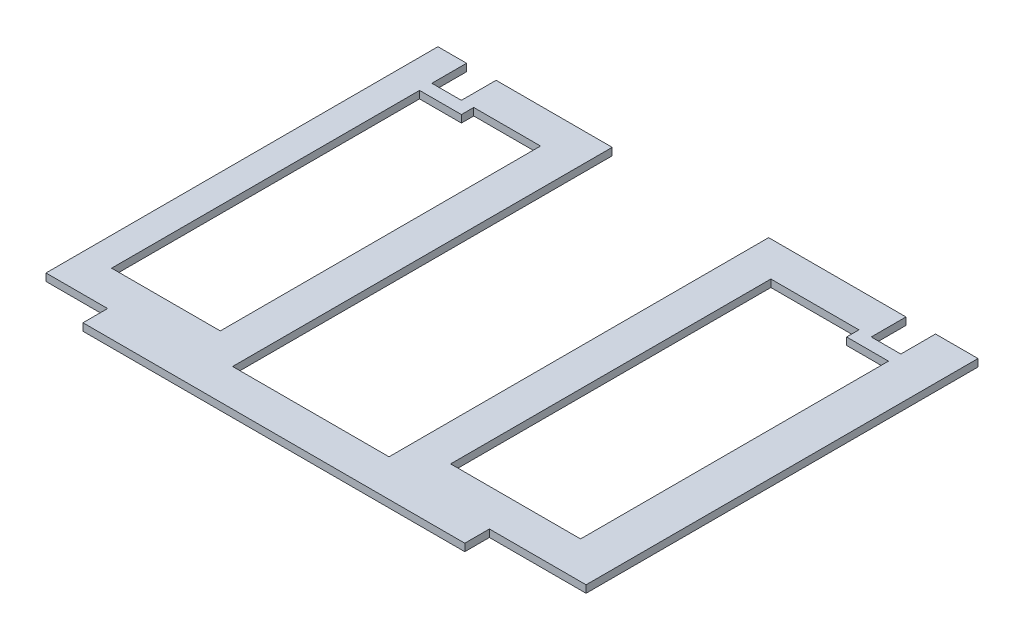
ISO-10303-21;
HEADER;
FILE_DESCRIPTION(('STEP AP214'),'2;1');
FILE_NAME('part.step','',(''),(''),'','','');
FILE_SCHEMA(('AUTOMOTIVE_DESIGN { 1 0 10303 214 1 1 1 1 }'));
ENDSEC;
DATA;
#1=APPLICATION_CONTEXT('core data for automotive mechanical design processes');
#2=APPLICATION_PROTOCOL_DEFINITION('international standard','automotive_design',2000,#1);
#3=PRODUCT_CONTEXT('',#1,'mechanical');
#4=PRODUCT('Part','Part','',(#3));
#5=PRODUCT_RELATED_PRODUCT_CATEGORY('part','',(#4));
#6=PRODUCT_DEFINITION_FORMATION('','',#4);
#7=PRODUCT_DEFINITION_CONTEXT('part definition',#1,'design');
#8=PRODUCT_DEFINITION('design','',#6,#7);
#9=PRODUCT_DEFINITION_SHAPE('','',#8);
#10=(LENGTH_UNIT() NAMED_UNIT(*) SI_UNIT(.MILLI.,.METRE.));
#11=(NAMED_UNIT(*) PLANE_ANGLE_UNIT() SI_UNIT($,.RADIAN.));
#12=(NAMED_UNIT(*) SI_UNIT($,.STERADIAN.) SOLID_ANGLE_UNIT());
#13=UNCERTAINTY_MEASURE_WITH_UNIT(LENGTH_MEASURE(1.E-05),#10,'distance_accuracy_value','');
#14=(GEOMETRIC_REPRESENTATION_CONTEXT(3) GLOBAL_UNCERTAINTY_ASSIGNED_CONTEXT((#13)) GLOBAL_UNIT_ASSIGNED_CONTEXT((#10,
#11,#12)) REPRESENTATION_CONTEXT('',''));
#15=CARTESIAN_POINT('',(0.,0.,0.));
#16=DIRECTION('',(0.,0.,1.));
#17=DIRECTION('',(1.,0.,0.));
#18=AXIS2_PLACEMENT_3D('',#15,#16,#17);
#19=CARTESIAN_POINT('',(-56.87,3.,-155.));
#20=DIRECTION('',(0.,0.,1.));
#21=DIRECTION('',(1.,0.,0.));
#22=AXIS2_PLACEMENT_3D('',#19,#20,#21);
#23=PLANE('',#22);
#24=DIRECTION('',(-1.,0.,0.));
#25=VECTOR('',#24,1.);
#26=CARTESIAN_POINT('',(-56.87,3.,-155.));
#27=LINE('',#26,#25);
#28=CARTESIAN_POINT('',(-56.87,3.,-155.));
#29=VERTEX_POINT('',#28);
#30=CARTESIAN_POINT('',(-83.99,3.,-155.));
#31=VERTEX_POINT('',#30);
#32=EDGE_CURVE('E63',#29,#31,#27,.T.);
#33=ORIENTED_EDGE('',*,*,#32,.T.);
#34=DIRECTION('',(0.,1.,0.));
#35=VECTOR('',#34,1.);
#36=CARTESIAN_POINT('',(-83.99,3.,-155.));
#37=LINE('',#36,#35);
#38=CARTESIAN_POINT('',(-83.99,0.,-155.));
#39=VERTEX_POINT('',#38);
#40=EDGE_CURVE('E873',#39,#31,#37,.T.);
#41=ORIENTED_EDGE('',*,*,#40,.F.);
#42=DIRECTION('',(-1.,0.,0.));
#43=VECTOR('',#42,1.);
#44=CARTESIAN_POINT('',(-56.87,0.,-155.));
#45=LINE('',#44,#43);
#46=CARTESIAN_POINT('',(-56.87,0.,-155.));
#47=VERTEX_POINT('',#46);
#48=EDGE_CURVE('E462',#47,#39,#45,.T.);
#49=ORIENTED_EDGE('',*,*,#48,.F.);
#50=DIRECTION('',(0.,-1.,0.));
#51=VECTOR('',#50,1.);
#52=CARTESIAN_POINT('',(-56.87,3.,-155.));
#53=LINE('',#52,#51);
#54=EDGE_CURVE('E495',#29,#47,#53,.T.);
#55=ORIENTED_EDGE('',*,*,#54,.F.);
#56=EDGE_LOOP('',(#33,#41,#49,#55));
#57=FACE_BOUND('',#56,.T.);
#58=ADVANCED_FACE('F39',(#57),#23,.T.);
#59=CARTESIAN_POINT('',(-100.99,3.,-169.09));
#60=DIRECTION('',(1.,0.,0.));
#61=DIRECTION('',(0.,0.,-1.));
#62=AXIS2_PLACEMENT_3D('',#59,#60,#61);
#63=PLANE('',#62);
#64=DIRECTION('',(0.,0.,1.));
#65=VECTOR('',#64,1.);
#66=CARTESIAN_POINT('',(-100.99,3.,-169.09));
#67=LINE('',#66,#65);
#68=CARTESIAN_POINT('',(-100.99,3.,-169.09));
#69=VERTEX_POINT('',#68);
#70=CARTESIAN_POINT('',(-100.99,3.,-155.));
#71=VERTEX_POINT('',#70);
#72=EDGE_CURVE('E450',#69,#71,#67,.T.);
#73=ORIENTED_EDGE('',*,*,#72,.T.);
#74=DIRECTION('',(0.,1.,0.));
#75=VECTOR('',#74,1.);
#76=CARTESIAN_POINT('',(-100.99,3.,-155.));
#77=LINE('',#76,#75);
#78=CARTESIAN_POINT('',(-100.99,0.,-155.));
#79=VERTEX_POINT('',#78);
#80=EDGE_CURVE('E886',#79,#71,#77,.T.);
#81=ORIENTED_EDGE('',*,*,#80,.F.);
#82=DIRECTION('',(0.,0.,1.));
#83=VECTOR('',#82,1.);
#84=CARTESIAN_POINT('',(-100.99,0.,-169.09));
#85=LINE('',#84,#83);
#86=CARTESIAN_POINT('',(-100.99,0.,-169.09));
#87=VERTEX_POINT('',#86);
#88=EDGE_CURVE('E471',#87,#79,#85,.T.);
#89=ORIENTED_EDGE('',*,*,#88,.F.);
#90=DIRECTION('',(0.,-1.,0.));
#91=VECTOR('',#90,1.);
#92=CARTESIAN_POINT('',(-100.99,3.,-169.09));
#93=LINE('',#92,#91);
#94=EDGE_CURVE('E485',#69,#87,#93,.T.);
#95=ORIENTED_EDGE('',*,*,#94,.F.);
#96=EDGE_LOOP('',(#73,#81,#89,#95));
#97=FACE_BOUND('',#96,.T.);
#98=ADVANCED_FACE('F567',(#97),#63,.T.);
#99=CARTESIAN_POINT('',(-100.99,0.,-150.));
#100=VERTEX_POINT('',#99);
#101=CARTESIAN_POINT('',(-100.99,0.,-25.));
#102=VERTEX_POINT('',#101);
#103=EDGE_CURVE('E470',#100,#102,#85,.T.);
#104=ORIENTED_EDGE('',*,*,#103,.F.);
#105=DIRECTION('',(0.,-1.,0.));
#106=VECTOR('',#105,1.);
#107=CARTESIAN_POINT('',(-100.99,3.,-150.));
#108=LINE('',#107,#106);
#109=CARTESIAN_POINT('',(-100.99,3.,-150.));
#110=VERTEX_POINT('',#109);
#111=EDGE_CURVE('E879',#110,#100,#108,.T.);
#112=ORIENTED_EDGE('',*,*,#111,.F.);
#113=CARTESIAN_POINT('',(-100.99,3.,-25.));
#114=VERTEX_POINT('',#113);
#115=EDGE_CURVE('E449',#110,#114,#67,.T.);
#116=ORIENTED_EDGE('',*,*,#115,.T.);
#117=DIRECTION('',(0.,-1.,0.));
#118=VECTOR('',#117,1.);
#119=CARTESIAN_POINT('',(-100.99,3.,-25.));
#120=LINE('',#119,#118);
#121=EDGE_CURVE('E481',#114,#102,#120,.T.);
#122=ORIENTED_EDGE('',*,*,#121,.T.);
#123=EDGE_LOOP('',(#104,#112,#116,#122));
#124=FACE_BOUND('',#123,.T.);
#125=ADVANCED_FACE('F572',(#124),#63,.T.);
#126=CARTESIAN_POINT('',(89.38,3.,-169.09));
#127=DIRECTION('',(-1.,0.,0.));
#128=DIRECTION('',(0.,0.,1.));
#129=AXIS2_PLACEMENT_3D('',#126,#127,#128);
#130=PLANE('',#129);
#131=DIRECTION('',(0.,0.,-1.));
#132=VECTOR('',#131,1.);
#133=CARTESIAN_POINT('',(89.38,0.,-169.09));
#134=LINE('',#133,#132);
#135=CARTESIAN_POINT('',(89.38,0.,-155.));
#136=VERTEX_POINT('',#135);
#137=CARTESIAN_POINT('',(89.38,0.,-169.09));
#138=VERTEX_POINT('',#137);
#139=EDGE_CURVE('E270',#136,#138,#134,.T.);
#140=ORIENTED_EDGE('',*,*,#139,.F.);
#141=DIRECTION('',(0.,-1.,0.));
#142=VECTOR('',#141,1.);
#143=CARTESIAN_POINT('',(89.38,0.,-155.));
#144=LINE('',#143,#142);
#145=CARTESIAN_POINT('',(89.38,3.,-155.));
#146=VERTEX_POINT('',#145);
#147=EDGE_CURVE('E909',#146,#136,#144,.T.);
#148=ORIENTED_EDGE('',*,*,#147,.F.);
#149=DIRECTION('',(0.,0.,-1.));
#150=VECTOR('',#149,1.);
#151=CARTESIAN_POINT('',(89.38,3.,-169.09));
#152=LINE('',#151,#150);
#153=CARTESIAN_POINT('',(89.38,3.,-169.09));
#154=VERTEX_POINT('',#153);
#155=EDGE_CURVE('E353',#146,#154,#152,.T.);
#156=ORIENTED_EDGE('',*,*,#155,.T.);
#157=DIRECTION('',(0.,-1.,0.));
#158=VECTOR('',#157,1.);
#159=CARTESIAN_POINT('',(89.38,3.,-169.09));
#160=LINE('',#159,#158);
#161=EDGE_CURVE('E296',#154,#138,#160,.T.);
#162=ORIENTED_EDGE('',*,*,#161,.T.);
#163=EDGE_LOOP('',(#140,#148,#156,#162));
#164=FACE_BOUND('',#163,.T.);
#165=ADVANCED_FACE('F612',(#164),#130,.T.);
#166=CARTESIAN_POINT('',(89.38,3.,-25.));
#167=VERTEX_POINT('',#166);
#168=CARTESIAN_POINT('',(89.38,3.,-150.));
#169=VERTEX_POINT('',#168);
#170=EDGE_CURVE('E355',#167,#169,#152,.T.);
#171=ORIENTED_EDGE('',*,*,#170,.T.);
#172=DIRECTION('',(0.,1.,0.));
#173=VECTOR('',#172,1.);
#174=CARTESIAN_POINT('',(89.38,0.,-150.));
#175=LINE('',#174,#173);
#176=CARTESIAN_POINT('',(89.38,0.,-150.));
#177=VERTEX_POINT('',#176);
#178=EDGE_CURVE('E915',#177,#169,#175,.T.);
#179=ORIENTED_EDGE('',*,*,#178,.F.);
#180=CARTESIAN_POINT('',(89.38,0.,-25.));
#181=VERTEX_POINT('',#180);
#182=EDGE_CURVE('E373',#181,#177,#134,.T.);
#183=ORIENTED_EDGE('',*,*,#182,.F.);
#184=DIRECTION('',(0.,-1.,0.));
#185=VECTOR('',#184,1.);
#186=CARTESIAN_POINT('',(89.38,3.,-25.));
#187=LINE('',#186,#185);
#188=EDGE_CURVE('E286',#167,#181,#187,.T.);
#189=ORIENTED_EDGE('',*,*,#188,.F.);
#190=EDGE_LOOP('',(#171,#179,#183,#189));
#191=FACE_BOUND('',#190,.T.);
#192=ADVANCED_FACE('F607',(#191),#130,.T.);
#193=CARTESIAN_POINT('',(36.63,3.,-155.));
#194=DIRECTION('',(0.,0.,1.));
#195=DIRECTION('',(1.,0.,0.));
#196=AXIS2_PLACEMENT_3D('',#193,#194,#195);
#197=PLANE('',#196);
#198=DIRECTION('',(-1.,0.,0.));
#199=VECTOR('',#198,1.);
#200=CARTESIAN_POINT('',(36.63,0.,-155.));
#201=LINE('',#200,#199);
#202=CARTESIAN_POINT('',(72.38,0.,-155.));
#203=VERTEX_POINT('',#202);
#204=CARTESIAN_POINT('',(36.63,0.,-155.));
#205=VERTEX_POINT('',#204);
#206=EDGE_CURVE('E381',#203,#205,#201,.T.);
#207=ORIENTED_EDGE('',*,*,#206,.F.);
#208=DIRECTION('',(0.,-1.,0.));
#209=VECTOR('',#208,1.);
#210=CARTESIAN_POINT('',(72.38,0.,-155.));
#211=LINE('',#210,#209);
#212=CARTESIAN_POINT('',(72.38,3.,-155.));
#213=VERTEX_POINT('',#212);
#214=EDGE_CURVE('E910',#213,#203,#211,.T.);
#215=ORIENTED_EDGE('',*,*,#214,.F.);
#216=DIRECTION('',(-1.,0.,0.));
#217=VECTOR('',#216,1.);
#218=CARTESIAN_POINT('',(36.63,3.,-155.));
#219=LINE('',#218,#217);
#220=CARTESIAN_POINT('',(36.63,3.,-155.));
#221=VERTEX_POINT('',#220);
#222=EDGE_CURVE('E362',#213,#221,#219,.T.);
#223=ORIENTED_EDGE('',*,*,#222,.T.);
#224=DIRECTION('',(0.,-1.,0.));
#225=VECTOR('',#224,1.);
#226=CARTESIAN_POINT('',(36.63,3.,-155.));
#227=LINE('',#226,#225);
#228=EDGE_CURVE('E390',#221,#205,#227,.T.);
#229=ORIENTED_EDGE('',*,*,#228,.T.);
#230=EDGE_LOOP('',(#207,#215,#223,#229));
#231=FACE_BOUND('',#230,.T.);
#232=ADVANCED_FACE('F565',(#231),#197,.T.);
#233=CARTESIAN_POINT('',(112.62,3.,-169.09));
#234=DIRECTION('',(0.,0.,1.));
#235=DIRECTION('',(1.,0.,0.));
#236=AXIS2_PLACEMENT_3D('',#233,#234,#235);
#237=PLANE('',#236);
#238=DIRECTION('',(0.,-1.,0.));
#239=VECTOR('',#238,1.);
#240=CARTESIAN_POINT('',(-89.,3.,-169.09));
#241=LINE('',#240,#239);
#242=CARTESIAN_POINT('',(-89.,3.,-169.09));
#243=VERTEX_POINT('',#242);
#244=CARTESIAN_POINT('',(-89.,0.,-169.09));
#245=VERTEX_POINT('',#244);
#246=EDGE_CURVE('E488',#243,#245,#241,.T.);
#247=ORIENTED_EDGE('',*,*,#246,.F.);
#248=DIRECTION('',(-1.,0.,0.));
#249=VECTOR('',#248,1.);
#250=CARTESIAN_POINT('',(112.62,3.,-169.09));
#251=LINE('',#250,#249);
#252=CARTESIAN_POINT('',(-41.87,3.,-169.09));
#253=VERTEX_POINT('',#252);
#254=EDGE_CURVE('E547',#253,#243,#251,.T.);
#255=ORIENTED_EDGE('',*,*,#254,.F.);
#256=DIRECTION('',(0.,-1.,0.));
#257=VECTOR('',#256,1.);
#258=CARTESIAN_POINT('',(-41.87,3.,-169.09));
#259=LINE('',#258,#257);
#260=CARTESIAN_POINT('',(-41.87,0.,-169.09));
#261=VERTEX_POINT('',#260);
#262=EDGE_CURVE('E372',#253,#261,#259,.T.);
#263=ORIENTED_EDGE('',*,*,#262,.T.);
#264=DIRECTION('',(-1.,0.,0.));
#265=VECTOR('',#264,1.);
#266=CARTESIAN_POINT('',(112.62,0.,-169.09));
#267=LINE('',#266,#265);
#268=EDGE_CURVE('E283',#261,#245,#267,.T.);
#269=ORIENTED_EDGE('',*,*,#268,.T.);
#270=EDGE_LOOP('',(#247,#255,#263,#269));
#271=FACE_BOUND('',#270,.T.);
#272=ADVANCED_FACE('F41',(#271),#237,.F.);
#273=ORIENTED_EDGE('',*,*,#94,.T.);
#274=CARTESIAN_POINT('',(-112.62,0.,-169.09));
#275=VERTEX_POINT('',#274);
#276=EDGE_CURVE('E276',#87,#275,#267,.T.);
#277=ORIENTED_EDGE('',*,*,#276,.T.);
#278=DIRECTION('',(0.,-1.,0.));
#279=VECTOR('',#278,1.);
#280=CARTESIAN_POINT('',(-112.62,3.,-169.09));
#281=LINE('',#280,#279);
#282=CARTESIAN_POINT('',(-112.62,3.,-169.09));
#283=VERTEX_POINT('',#282);
#284=EDGE_CURVE('E11',#283,#275,#281,.T.);
#285=ORIENTED_EDGE('',*,*,#284,.F.);
#286=EDGE_CURVE('E310',#69,#283,#251,.T.);
#287=ORIENTED_EDGE('',*,*,#286,.F.);
#288=EDGE_LOOP('',(#273,#277,#285,#287));
#289=FACE_BOUND('',#288,.T.);
#290=ADVANCED_FACE('F559',(#289),#237,.F.);
#291=DIRECTION('',(0.,-1.,0.));
#292=VECTOR('',#291,1.);
#293=CARTESIAN_POINT('',(21.63,3.,-169.09));
#294=LINE('',#293,#292);
#295=CARTESIAN_POINT('',(21.63,3.,-169.09));
#296=VERTEX_POINT('',#295);
#297=CARTESIAN_POINT('',(21.63,0.,-169.09));
#298=VERTEX_POINT('',#297);
#299=EDGE_CURVE('E427',#296,#298,#294,.T.);
#300=ORIENTED_EDGE('',*,*,#299,.F.);
#301=CARTESIAN_POINT('',(77.38,3.,-169.09));
#302=VERTEX_POINT('',#301);
#303=EDGE_CURVE('E309',#302,#296,#251,.T.);
#304=ORIENTED_EDGE('',*,*,#303,.F.);
#305=DIRECTION('',(0.,-1.,0.));
#306=VECTOR('',#305,1.);
#307=CARTESIAN_POINT('',(77.38,3.,-169.09));
#308=LINE('',#307,#306);
#309=CARTESIAN_POINT('',(77.38,0.,-169.09));
#310=VERTEX_POINT('',#309);
#311=EDGE_CURVE('E302',#302,#310,#308,.T.);
#312=ORIENTED_EDGE('',*,*,#311,.T.);
#313=EDGE_CURVE('E274',#310,#298,#267,.T.);
#314=ORIENTED_EDGE('',*,*,#313,.T.);
#315=EDGE_LOOP('',(#300,#304,#312,#314));
#316=FACE_BOUND('',#315,.T.);
#317=ADVANCED_FACE('F403',(#316),#237,.F.);
#318=CARTESIAN_POINT('',(106.62,3.,-169.09));
#319=VERTEX_POINT('',#318);
#320=EDGE_CURVE('E264',#319,#154,#251,.T.);
#321=ORIENTED_EDGE('',*,*,#320,.F.);
#322=DIRECTION('',(0.,1.,0.));
#323=VECTOR('',#322,1.);
#324=CARTESIAN_POINT('',(106.62,0.,-169.09));
#325=LINE('',#324,#323);
#326=CARTESIAN_POINT('',(106.62,0.,-169.09));
#327=VERTEX_POINT('',#326);
#328=EDGE_CURVE('E251',#327,#319,#325,.T.);
#329=ORIENTED_EDGE('',*,*,#328,.F.);
#330=EDGE_CURVE('E262',#327,#138,#267,.T.);
#331=ORIENTED_EDGE('',*,*,#330,.T.);
#332=ORIENTED_EDGE('',*,*,#161,.F.);
#333=EDGE_LOOP('',(#321,#329,#331,#332));
#334=FACE_BOUND('',#333,.T.);
#335=ADVANCED_FACE('F260',(#334),#237,.F.);
#336=CARTESIAN_POINT('',(-112.62,3.,-169.09));
#337=DIRECTION('',(1.,0.,0.));
#338=DIRECTION('',(0.,0.,-1.));
#339=AXIS2_PLACEMENT_3D('',#336,#337,#338);
#340=PLANE('',#339);
#341=DIRECTION('',(0.,-1.,0.));
#342=VECTOR('',#341,1.);
#343=CARTESIAN_POINT('',(-112.62,3.,-9.99999999999997));
#344=LINE('',#343,#342);
#345=CARTESIAN_POINT('',(-112.62,3.,-9.99999999999997));
#346=VERTEX_POINT('',#345);
#347=CARTESIAN_POINT('',(-112.62,0.,-9.99999999999998));
#348=VERTEX_POINT('',#347);
#349=EDGE_CURVE('E505',#346,#348,#344,.T.);
#350=ORIENTED_EDGE('',*,*,#349,.F.);
#351=DIRECTION('',(0.,0.,1.));
#352=VECTOR('',#351,1.);
#353=CARTESIAN_POINT('',(-112.62,3.,-169.09));
#354=LINE('',#353,#352);
#355=EDGE_CURVE('E308',#283,#346,#354,.T.);
#356=ORIENTED_EDGE('',*,*,#355,.F.);
#357=ORIENTED_EDGE('',*,*,#284,.T.);
#358=DIRECTION('',(0.,0.,1.));
#359=VECTOR('',#358,1.);
#360=CARTESIAN_POINT('',(-112.62,0.,-169.09));
#361=LINE('',#360,#359);
#362=EDGE_CURVE('E273',#275,#348,#361,.T.);
#363=ORIENTED_EDGE('',*,*,#362,.T.);
#364=EDGE_LOOP('',(#350,#356,#357,#363));
#365=FACE_BOUND('',#364,.T.);
#366=ADVANCED_FACE('F558',(#365),#340,.F.);
#367=CARTESIAN_POINT('',(-112.62,3.,0.));
#368=DIRECTION('',(0.,0.,-1.));
#369=DIRECTION('',(-1.,0.,0.));
#370=AXIS2_PLACEMENT_3D('',#367,#368,#369);
#371=PLANE('',#370);
#372=DIRECTION('',(0.,-1.,0.));
#373=VECTOR('',#372,1.);
#374=CARTESIAN_POINT('',(67.38,3.,0.));
#375=LINE('',#374,#373);
#376=CARTESIAN_POINT('',(67.38,3.,0.));
#377=VERTEX_POINT('',#376);
#378=CARTESIAN_POINT('',(67.38,0.,0.));
#379=VERTEX_POINT('',#378);
#380=EDGE_CURVE('E332',#377,#379,#375,.T.);
#381=ORIENTED_EDGE('',*,*,#380,.F.);
#382=DIRECTION('',(1.,0.,0.));
#383=VECTOR('',#382,1.);
#384=CARTESIAN_POINT('',(-112.62,3.,0.));
#385=LINE('',#384,#383);
#386=CARTESIAN_POINT('',(-87.61,3.,0.));
#387=VERTEX_POINT('',#386);
#388=EDGE_CURVE('E48',#387,#377,#385,.T.);
#389=ORIENTED_EDGE('',*,*,#388,.F.);
#390=DIRECTION('',(0.,-1.,0.));
#391=VECTOR('',#390,1.);
#392=CARTESIAN_POINT('',(-87.61,3.,0.));
#393=LINE('',#392,#391);
#394=CARTESIAN_POINT('',(-87.61,0.,0.));
#395=VERTEX_POINT('',#394);
#396=EDGE_CURVE('E330',#387,#395,#393,.T.);
#397=ORIENTED_EDGE('',*,*,#396,.T.);
#398=DIRECTION('',(1.,0.,0.));
#399=VECTOR('',#398,1.);
#400=CARTESIAN_POINT('',(-112.62,0.,0.));
#401=LINE('',#400,#399);
#402=EDGE_CURVE('E280',#395,#379,#401,.T.);
#403=ORIENTED_EDGE('',*,*,#402,.T.);
#404=EDGE_LOOP('',(#381,#389,#397,#403));
#405=FACE_BOUND('',#404,.T.);
#406=ADVANCED_FACE('F328',(#405),#371,.F.);
#407=CARTESIAN_POINT('',(0.,3.,0.));
#408=DIRECTION('',(0.,1.,0.));
#409=DIRECTION('',(0.,0.,1.));
#410=AXIS2_PLACEMENT_3D('',#407,#408,#409);
#411=PLANE('',#410);
#412=DIRECTION('',(0.,0.,1.));
#413=VECTOR('',#412,1.);
#414=CARTESIAN_POINT('',(106.62,3.,-10.));
#415=LINE('',#414,#413);
#416=CARTESIAN_POINT('',(106.62,3.,-10.));
#417=VERTEX_POINT('',#416);
#418=EDGE_CURVE('E55',#319,#417,#415,.T.);
#419=ORIENTED_EDGE('',*,*,#418,.F.);
#420=ORIENTED_EDGE('',*,*,#320,.T.);
#421=ORIENTED_EDGE('',*,*,#155,.F.);
#422=DIRECTION('',(1.,0.,0.));
#423=VECTOR('',#422,1.);
#424=CARTESIAN_POINT('',(72.38,3.,-155.));
#425=LINE('',#424,#423);
#426=CARTESIAN_POINT('',(77.38,3.,-155.));
#427=VERTEX_POINT('',#426);
#428=EDGE_CURVE('E924',#427,#146,#425,.T.);
#429=ORIENTED_EDGE('',*,*,#428,.F.);
#430=DIRECTION('',(0.,0.,1.));
#431=VECTOR('',#430,1.);
#432=CARTESIAN_POINT('',(77.38,3.,-155.));
#433=LINE('',#432,#431);
#434=EDGE_CURVE('E358',#302,#427,#433,.T.);
#435=ORIENTED_EDGE('',*,*,#434,.F.);
#436=ORIENTED_EDGE('',*,*,#303,.T.);
#437=DIRECTION('',(0.,0.,-1.));
#438=VECTOR('',#437,1.);
#439=CARTESIAN_POINT('',(21.63,3.,-169.09));
#440=LINE('',#439,#438);
#441=CARTESIAN_POINT('',(21.63,3.,-15.));
#442=VERTEX_POINT('',#441);
#443=EDGE_CURVE('E431',#442,#296,#440,.T.);
#444=ORIENTED_EDGE('',*,*,#443,.F.);
#445=DIRECTION('',(1.,0.,0.));
#446=VECTOR('',#445,1.);
#447=CARTESIAN_POINT('',(-41.87,3.,-15.));
#448=LINE('',#447,#446);
#449=CARTESIAN_POINT('',(-41.87,3.,-15.));
#450=VERTEX_POINT('',#449);
#451=EDGE_CURVE('E421',#450,#442,#448,.T.);
#452=ORIENTED_EDGE('',*,*,#451,.F.);
#453=DIRECTION('',(0.,0.,1.));
#454=VECTOR('',#453,1.);
#455=CARTESIAN_POINT('',(-41.87,3.,-169.09));
#456=LINE('',#455,#454);
#457=EDGE_CURVE('E417',#253,#450,#456,.T.);
#458=ORIENTED_EDGE('',*,*,#457,.F.);
#459=ORIENTED_EDGE('',*,*,#254,.T.);
#460=DIRECTION('',(0.,0.,-1.));
#461=VECTOR('',#460,1.);
#462=CARTESIAN_POINT('',(-89.,3.,-155.));
#463=LINE('',#462,#461);
#464=CARTESIAN_POINT('',(-89.,3.,-155.));
#465=VERTEX_POINT('',#464);
#466=EDGE_CURVE('E446',#465,#243,#463,.T.);
#467=ORIENTED_EDGE('',*,*,#466,.F.);
#468=DIRECTION('',(-1.,0.,0.));
#469=VECTOR('',#468,1.);
#470=CARTESIAN_POINT('',(-83.99,3.,-155.));
#471=LINE('',#470,#469);
#472=EDGE_CURVE('E906',#465,#71,#471,.T.);
#473=ORIENTED_EDGE('',*,*,#472,.T.);
#474=ORIENTED_EDGE('',*,*,#72,.F.);
#475=ORIENTED_EDGE('',*,*,#286,.T.);
#476=ORIENTED_EDGE('',*,*,#355,.T.);
#477=DIRECTION('',(-1.,0.,0.));
#478=VECTOR('',#477,1.);
#479=CARTESIAN_POINT('',(-112.62,3.,-9.99999999999997));
#480=LINE('',#479,#478);
#481=CARTESIAN_POINT('',(-87.61,3.,-9.99999999999997));
#482=VERTEX_POINT('',#481);
#483=EDGE_CURVE('E501',#482,#346,#480,.T.);
#484=ORIENTED_EDGE('',*,*,#483,.F.);
#485=DIRECTION('',(0.,0.,-1.));
#486=VECTOR('',#485,1.);
#487=CARTESIAN_POINT('',(-87.61,3.,0.));
#488=LINE('',#487,#486);
#489=EDGE_CURVE('E324',#387,#482,#488,.T.);
#490=ORIENTED_EDGE('',*,*,#489,.F.);
#491=ORIENTED_EDGE('',*,*,#388,.T.);
#492=DIRECTION('',(0.,0.,1.));
#493=VECTOR('',#492,1.);
#494=CARTESIAN_POINT('',(67.38,3.,0.));
#495=LINE('',#494,#493);
#496=CARTESIAN_POINT('',(67.38,3.,-9.99999999999999));
#497=VERTEX_POINT('',#496);
#498=EDGE_CURVE('E322',#497,#377,#495,.T.);
#499=ORIENTED_EDGE('',*,*,#498,.F.);
#500=DIRECTION('',(-1.,0.,0.));
#501=VECTOR('',#500,1.);
#502=CARTESIAN_POINT('',(112.62,3.,-10.));
#503=LINE('',#502,#501);
#504=EDGE_CURVE('E344',#417,#497,#503,.T.);
#505=ORIENTED_EDGE('',*,*,#504,.F.);
#506=EDGE_LOOP('',(#419,#420,#421,#429,#435,#436,#444,#452,#458,#459,#467,#473,#474,#475,#476,
#484,#490,#491,#499,#505));
#507=FACE_BOUND('',#506,.T.);
#508=DIRECTION('',(0.,0.,1.));
#509=VECTOR('',#508,1.);
#510=CARTESIAN_POINT('',(-83.99,3.,-155.));
#511=LINE('',#510,#509);
#512=CARTESIAN_POINT('',(-83.99,3.,-150.));
#513=VERTEX_POINT('',#512);
#514=EDGE_CURVE('E874',#31,#513,#511,.T.);
#515=ORIENTED_EDGE('',*,*,#514,.F.);
#516=ORIENTED_EDGE('',*,*,#32,.F.);
#517=DIRECTION('',(0.,0.,-1.));
#518=VECTOR('',#517,1.);
#519=CARTESIAN_POINT('',(-56.87,3.,-155.));
#520=LINE('',#519,#518);
#521=CARTESIAN_POINT('',(-56.87,3.,-25.));
#522=VERTEX_POINT('',#521);
#523=EDGE_CURVE('E440',#522,#29,#520,.T.);
#524=ORIENTED_EDGE('',*,*,#523,.F.);
#525=DIRECTION('',(1.,0.,0.));
#526=VECTOR('',#525,1.);
#527=CARTESIAN_POINT('',(-100.99,3.,-25.));
#528=LINE('',#527,#526);
#529=EDGE_CURVE('E454',#114,#522,#528,.T.);
#530=ORIENTED_EDGE('',*,*,#529,.F.);
#531=ORIENTED_EDGE('',*,*,#115,.F.);
#532=DIRECTION('',(-1.,0.,0.));
#533=VECTOR('',#532,1.);
#534=CARTESIAN_POINT('',(-83.99,3.,-150.));
#535=LINE('',#534,#533);
#536=EDGE_CURVE('E903',#513,#110,#535,.T.);
#537=ORIENTED_EDGE('',*,*,#536,.F.);
#538=EDGE_LOOP('',(#515,#516,#524,#530,#531,#537));
#539=FACE_BOUND('',#538,.T.);
#540=DIRECTION('',(1.,0.,0.));
#541=VECTOR('',#540,1.);
#542=CARTESIAN_POINT('',(72.38,3.,-150.));
#543=LINE('',#542,#541);
#544=CARTESIAN_POINT('',(72.38,3.,-150.));
#545=VERTEX_POINT('',#544);
#546=EDGE_CURVE('E530',#545,#169,#543,.T.);
#547=ORIENTED_EDGE('',*,*,#546,.T.);
#548=ORIENTED_EDGE('',*,*,#170,.F.);
#549=DIRECTION('',(1.,0.,0.));
#550=VECTOR('',#549,1.);
#551=CARTESIAN_POINT('',(36.63,3.,-25.));
#552=LINE('',#551,#550);
#553=CARTESIAN_POINT('',(36.63,3.,-25.));
#554=VERTEX_POINT('',#553);
#555=EDGE_CURVE('E350',#554,#167,#552,.T.);
#556=ORIENTED_EDGE('',*,*,#555,.F.);
#557=DIRECTION('',(0.,0.,1.));
#558=VECTOR('',#557,1.);
#559=CARTESIAN_POINT('',(36.63,3.,-25.));
#560=LINE('',#559,#558);
#561=EDGE_CURVE('E365',#221,#554,#560,.T.);
#562=ORIENTED_EDGE('',*,*,#561,.F.);
#563=ORIENTED_EDGE('',*,*,#222,.F.);
#564=DIRECTION('',(0.,0.,-1.));
#565=VECTOR('',#564,1.);
#566=CARTESIAN_POINT('',(72.38,3.,-155.));
#567=LINE('',#566,#565);
#568=EDGE_CURVE('E921',#545,#213,#567,.T.);
#569=ORIENTED_EDGE('',*,*,#568,.F.);
#570=EDGE_LOOP('',(#547,#548,#556,#562,#563,#569));
#571=FACE_BOUND('',#570,.T.);
#572=ADVANCED_FACE('F319',(#507,#539,#571),#411,.T.);
#573=CARTESIAN_POINT('',(0.,0.,0.));
#574=DIRECTION('',(0.,1.,0.));
#575=DIRECTION('',(0.,0.,1.));
#576=AXIS2_PLACEMENT_3D('',#573,#574,#575);
#577=PLANE('',#576);
#578=ORIENTED_EDGE('',*,*,#330,.F.);
#579=DIRECTION('',(0.,0.,1.));
#580=VECTOR('',#579,1.);
#581=CARTESIAN_POINT('',(106.62,0.,-10.));
#582=LINE('',#581,#580);
#583=CARTESIAN_POINT('',(106.62,0.,-10.));
#584=VERTEX_POINT('',#583);
#585=EDGE_CURVE('E248',#327,#584,#582,.T.);
#586=ORIENTED_EDGE('',*,*,#585,.T.);
#587=DIRECTION('',(-1.,0.,0.));
#588=VECTOR('',#587,1.);
#589=CARTESIAN_POINT('',(112.62,0.,-10.));
#590=LINE('',#589,#588);
#591=CARTESIAN_POINT('',(67.38,0.,-9.99999999999999));
#592=VERTEX_POINT('',#591);
#593=EDGE_CURVE('E520',#584,#592,#590,.T.);
#594=ORIENTED_EDGE('',*,*,#593,.T.);
#595=DIRECTION('',(0.,0.,1.));
#596=VECTOR('',#595,1.);
#597=CARTESIAN_POINT('',(67.38,0.,0.));
#598=LINE('',#597,#596);
#599=EDGE_CURVE('E347',#592,#379,#598,.T.);
#600=ORIENTED_EDGE('',*,*,#599,.T.);
#601=ORIENTED_EDGE('',*,*,#402,.F.);
#602=DIRECTION('',(0.,0.,-1.));
#603=VECTOR('',#602,1.);
#604=CARTESIAN_POINT('',(-87.61,0.,0.));
#605=LINE('',#604,#603);
#606=CARTESIAN_POINT('',(-87.61,0.,-9.99999999999997));
#607=VERTEX_POINT('',#606);
#608=EDGE_CURVE('E342',#395,#607,#605,.T.);
#609=ORIENTED_EDGE('',*,*,#608,.T.);
#610=DIRECTION('',(-1.,0.,0.));
#611=VECTOR('',#610,1.);
#612=CARTESIAN_POINT('',(-112.62,0.,-9.99999999999997));
#613=LINE('',#612,#611);
#614=EDGE_CURVE('E502',#607,#348,#613,.T.);
#615=ORIENTED_EDGE('',*,*,#614,.T.);
#616=ORIENTED_EDGE('',*,*,#362,.F.);
#617=ORIENTED_EDGE('',*,*,#276,.F.);
#618=ORIENTED_EDGE('',*,*,#88,.T.);
#619=DIRECTION('',(-1.,0.,0.));
#620=VECTOR('',#619,1.);
#621=CARTESIAN_POINT('',(-83.99,0.,-155.));
#622=LINE('',#621,#620);
#623=CARTESIAN_POINT('',(-89.,0.,-155.));
#624=VERTEX_POINT('',#623);
#625=EDGE_CURVE('E894',#624,#79,#622,.T.);
#626=ORIENTED_EDGE('',*,*,#625,.F.);
#627=DIRECTION('',(0.,0.,-1.));
#628=VECTOR('',#627,1.);
#629=CARTESIAN_POINT('',(-89.,0.,-155.));
#630=LINE('',#629,#628);
#631=EDGE_CURVE('E466',#624,#245,#630,.T.);
#632=ORIENTED_EDGE('',*,*,#631,.T.);
#633=ORIENTED_EDGE('',*,*,#268,.F.);
#634=DIRECTION('',(0.,0.,1.));
#635=VECTOR('',#634,1.);
#636=CARTESIAN_POINT('',(-41.87,0.,-169.09));
#637=LINE('',#636,#635);
#638=CARTESIAN_POINT('',(-41.87,0.,-15.));
#639=VERTEX_POINT('',#638);
#640=EDGE_CURVE('E423',#261,#639,#637,.T.);
#641=ORIENTED_EDGE('',*,*,#640,.T.);
#642=DIRECTION('',(1.,0.,0.));
#643=VECTOR('',#642,1.);
#644=CARTESIAN_POINT('',(-41.87,0.,-15.));
#645=LINE('',#644,#643);
#646=CARTESIAN_POINT('',(21.63,0.,-15.));
#647=VERTEX_POINT('',#646);
#648=EDGE_CURVE('E413',#639,#647,#645,.T.);
#649=ORIENTED_EDGE('',*,*,#648,.T.);
#650=DIRECTION('',(0.,0.,-1.));
#651=VECTOR('',#650,1.);
#652=CARTESIAN_POINT('',(21.63,0.,-169.09));
#653=LINE('',#652,#651);
#654=EDGE_CURVE('E410',#647,#298,#653,.T.);
#655=ORIENTED_EDGE('',*,*,#654,.T.);
#656=ORIENTED_EDGE('',*,*,#313,.F.);
#657=DIRECTION('',(0.,0.,1.));
#658=VECTOR('',#657,1.);
#659=CARTESIAN_POINT('',(77.38,0.,-155.));
#660=LINE('',#659,#658);
#661=CARTESIAN_POINT('',(77.38,0.,-155.));
#662=VERTEX_POINT('',#661);
#663=EDGE_CURVE('E377',#310,#662,#660,.T.);
#664=ORIENTED_EDGE('',*,*,#663,.T.);
#665=DIRECTION('',(1.,0.,0.));
#666=VECTOR('',#665,1.);
#667=CARTESIAN_POINT('',(72.38,0.,-155.));
#668=LINE('',#667,#666);
#669=EDGE_CURVE('E522',#662,#136,#668,.T.);
#670=ORIENTED_EDGE('',*,*,#669,.T.);
#671=ORIENTED_EDGE('',*,*,#139,.T.);
#672=EDGE_LOOP('',(#578,#586,#594,#600,#601,#609,#615,#616,#617,#618,#626,#632,#633,#641,#649,
#655,#656,#664,#670,#671));
#673=FACE_BOUND('',#672,.T.);
#674=ORIENTED_EDGE('',*,*,#182,.T.);
#675=DIRECTION('',(1.,0.,0.));
#676=VECTOR('',#675,1.);
#677=CARTESIAN_POINT('',(72.38,0.,-150.));
#678=LINE('',#677,#676);
#679=CARTESIAN_POINT('',(72.38,0.,-150.));
#680=VERTEX_POINT('',#679);
#681=EDGE_CURVE('E525',#680,#177,#678,.T.);
#682=ORIENTED_EDGE('',*,*,#681,.F.);
#683=DIRECTION('',(0.,0.,1.));
#684=VECTOR('',#683,1.);
#685=CARTESIAN_POINT('',(72.38,0.,-155.));
#686=LINE('',#685,#684);
#687=EDGE_CURVE('E914',#203,#680,#686,.T.);
#688=ORIENTED_EDGE('',*,*,#687,.F.);
#689=ORIENTED_EDGE('',*,*,#206,.T.);
#690=DIRECTION('',(0.,0.,1.));
#691=VECTOR('',#690,1.);
#692=CARTESIAN_POINT('',(36.63,0.,-25.));
#693=LINE('',#692,#691);
#694=CARTESIAN_POINT('',(36.63,0.,-25.));
#695=VERTEX_POINT('',#694);
#696=EDGE_CURVE('E354',#205,#695,#693,.T.);
#697=ORIENTED_EDGE('',*,*,#696,.T.);
#698=DIRECTION('',(1.,0.,0.));
#699=VECTOR('',#698,1.);
#700=CARTESIAN_POINT('',(36.63,0.,-25.));
#701=LINE('',#700,#699);
#702=EDGE_CURVE('E369',#695,#181,#701,.T.);
#703=ORIENTED_EDGE('',*,*,#702,.T.);
#704=EDGE_LOOP('',(#674,#682,#688,#689,#697,#703));
#705=FACE_BOUND('',#704,.T.);
#706=ORIENTED_EDGE('',*,*,#48,.T.);
#707=DIRECTION('',(0.,0.,-1.));
#708=VECTOR('',#707,1.);
#709=CARTESIAN_POINT('',(-83.99,0.,-155.));
#710=LINE('',#709,#708);
#711=CARTESIAN_POINT('',(-83.99,0.,-150.));
#712=VERTEX_POINT('',#711);
#713=EDGE_CURVE('E877',#712,#39,#710,.T.);
#714=ORIENTED_EDGE('',*,*,#713,.F.);
#715=DIRECTION('',(-1.,0.,0.));
#716=VECTOR('',#715,1.);
#717=CARTESIAN_POINT('',(-83.99,0.,-150.));
#718=LINE('',#717,#716);
#719=EDGE_CURVE('E900',#712,#100,#718,.T.);
#720=ORIENTED_EDGE('',*,*,#719,.T.);
#721=ORIENTED_EDGE('',*,*,#103,.T.);
#722=DIRECTION('',(1.,0.,0.));
#723=VECTOR('',#722,1.);
#724=CARTESIAN_POINT('',(-100.99,0.,-25.));
#725=LINE('',#724,#723);
#726=CARTESIAN_POINT('',(-56.87,0.,-25.));
#727=VERTEX_POINT('',#726);
#728=EDGE_CURVE('E443',#102,#727,#725,.T.);
#729=ORIENTED_EDGE('',*,*,#728,.T.);
#730=DIRECTION('',(0.,0.,-1.));
#731=VECTOR('',#730,1.);
#732=CARTESIAN_POINT('',(-56.87,0.,-155.));
#733=LINE('',#732,#731);
#734=EDGE_CURVE('E458',#727,#47,#733,.T.);
#735=ORIENTED_EDGE('',*,*,#734,.T.);
#736=EDGE_LOOP('',(#706,#714,#720,#721,#729,#735));
#737=FACE_BOUND('',#736,.T.);
#738=ADVANCED_FACE('F267',(#673,#705,#737),#577,.F.);
#739=CARTESIAN_POINT('',(36.63,3.,-25.));
#740=DIRECTION('',(0.,0.,-1.));
#741=DIRECTION('',(-1.,0.,0.));
#742=AXIS2_PLACEMENT_3D('',#739,#740,#741);
#743=PLANE('',#742);
#744=ORIENTED_EDGE('',*,*,#702,.F.);
#745=DIRECTION('',(0.,-1.,0.));
#746=VECTOR('',#745,1.);
#747=CARTESIAN_POINT('',(36.63,3.,-25.));
#748=LINE('',#747,#746);
#749=EDGE_CURVE('E368',#554,#695,#748,.T.);
#750=ORIENTED_EDGE('',*,*,#749,.F.);
#751=ORIENTED_EDGE('',*,*,#555,.T.);
#752=ORIENTED_EDGE('',*,*,#188,.T.);
#753=EDGE_LOOP('',(#744,#750,#751,#752));
#754=FACE_BOUND('',#753,.T.);
#755=ADVANCED_FACE('F611',(#754),#743,.T.);
#756=CARTESIAN_POINT('',(77.38,3.,-155.));
#757=DIRECTION('',(1.,0.,0.));
#758=DIRECTION('',(0.,0.,-1.));
#759=AXIS2_PLACEMENT_3D('',#756,#757,#758);
#760=PLANE('',#759);
#761=ORIENTED_EDGE('',*,*,#663,.F.);
#762=ORIENTED_EDGE('',*,*,#311,.F.);
#763=ORIENTED_EDGE('',*,*,#434,.T.);
#764=DIRECTION('',(0.,-1.,0.));
#765=VECTOR('',#764,1.);
#766=CARTESIAN_POINT('',(77.38,3.,-155.));
#767=LINE('',#766,#765);
#768=EDGE_CURVE('E394',#427,#662,#767,.T.);
#769=ORIENTED_EDGE('',*,*,#768,.T.);
#770=EDGE_LOOP('',(#761,#762,#763,#769));
#771=FACE_BOUND('',#770,.T.);
#772=ADVANCED_FACE('F603',(#771),#760,.T.);
#773=CARTESIAN_POINT('',(36.63,3.,-25.));
#774=DIRECTION('',(1.,0.,0.));
#775=DIRECTION('',(0.,0.,-1.));
#776=AXIS2_PLACEMENT_3D('',#773,#774,#775);
#777=PLANE('',#776);
#778=ORIENTED_EDGE('',*,*,#696,.F.);
#779=ORIENTED_EDGE('',*,*,#228,.F.);
#780=ORIENTED_EDGE('',*,*,#561,.T.);
#781=ORIENTED_EDGE('',*,*,#749,.T.);
#782=EDGE_LOOP('',(#778,#779,#780,#781));
#783=FACE_BOUND('',#782,.T.);
#784=ADVANCED_FACE('F600',(#783),#777,.T.);
#785=CARTESIAN_POINT('',(-41.87,3.,-169.09));
#786=DIRECTION('',(1.,0.,0.));
#787=DIRECTION('',(0.,0.,-1.));
#788=AXIS2_PLACEMENT_3D('',#785,#786,#787);
#789=PLANE('',#788);
#790=ORIENTED_EDGE('',*,*,#640,.F.);
#791=ORIENTED_EDGE('',*,*,#262,.F.);
#792=ORIENTED_EDGE('',*,*,#457,.T.);
#793=DIRECTION('',(0.,-1.,0.));
#794=VECTOR('',#793,1.);
#795=CARTESIAN_POINT('',(-41.87,3.,-15.));
#796=LINE('',#795,#794);
#797=EDGE_CURVE('E434',#450,#639,#796,.T.);
#798=ORIENTED_EDGE('',*,*,#797,.T.);
#799=EDGE_LOOP('',(#790,#791,#792,#798));
#800=FACE_BOUND('',#799,.T.);
#801=ADVANCED_FACE('F540',(#800),#789,.T.);
#802=CARTESIAN_POINT('',(-41.87,3.,-15.));
#803=DIRECTION('',(0.,0.,-1.));
#804=DIRECTION('',(-1.,0.,0.));
#805=AXIS2_PLACEMENT_3D('',#802,#803,#804);
#806=PLANE('',#805);
#807=ORIENTED_EDGE('',*,*,#648,.F.);
#808=ORIENTED_EDGE('',*,*,#797,.F.);
#809=ORIENTED_EDGE('',*,*,#451,.T.);
#810=DIRECTION('',(0.,-1.,0.));
#811=VECTOR('',#810,1.);
#812=CARTESIAN_POINT('',(21.63,3.,-15.));
#813=LINE('',#812,#811);
#814=EDGE_CURVE('E430',#442,#647,#813,.T.);
#815=ORIENTED_EDGE('',*,*,#814,.T.);
#816=EDGE_LOOP('',(#807,#808,#809,#815));
#817=FACE_BOUND('',#816,.T.);
#818=ADVANCED_FACE('F672',(#817),#806,.T.);
#819=CARTESIAN_POINT('',(21.63,3.,-169.09));
#820=DIRECTION('',(-1.,0.,0.));
#821=DIRECTION('',(0.,0.,1.));
#822=AXIS2_PLACEMENT_3D('',#819,#820,#821);
#823=PLANE('',#822);
#824=ORIENTED_EDGE('',*,*,#654,.F.);
#825=ORIENTED_EDGE('',*,*,#814,.F.);
#826=ORIENTED_EDGE('',*,*,#443,.T.);
#827=ORIENTED_EDGE('',*,*,#299,.T.);
#828=EDGE_LOOP('',(#824,#825,#826,#827));
#829=FACE_BOUND('',#828,.T.);
#830=ADVANCED_FACE('F581',(#829),#823,.T.);
#831=CARTESIAN_POINT('',(-56.87,3.,-155.));
#832=DIRECTION('',(-1.,0.,0.));
#833=DIRECTION('',(0.,0.,1.));
#834=AXIS2_PLACEMENT_3D('',#831,#832,#833);
#835=PLANE('',#834);
#836=ORIENTED_EDGE('',*,*,#734,.F.);
#837=DIRECTION('',(0.,-1.,0.));
#838=VECTOR('',#837,1.);
#839=CARTESIAN_POINT('',(-56.87,3.,-25.));
#840=LINE('',#839,#838);
#841=EDGE_CURVE('E457',#522,#727,#840,.T.);
#842=ORIENTED_EDGE('',*,*,#841,.F.);
#843=ORIENTED_EDGE('',*,*,#523,.T.);
#844=ORIENTED_EDGE('',*,*,#54,.T.);
#845=EDGE_LOOP('',(#836,#842,#843,#844));
#846=FACE_BOUND('',#845,.T.);
#847=ADVANCED_FACE('F578',(#846),#835,.T.);
#848=CARTESIAN_POINT('',(-89.,3.,-155.));
#849=DIRECTION('',(-1.,0.,0.));
#850=DIRECTION('',(0.,0.,1.));
#851=AXIS2_PLACEMENT_3D('',#848,#849,#850);
#852=PLANE('',#851);
#853=ORIENTED_EDGE('',*,*,#631,.F.);
#854=DIRECTION('',(0.,-1.,0.));
#855=VECTOR('',#854,1.);
#856=CARTESIAN_POINT('',(-89.,3.,-155.));
#857=LINE('',#856,#855);
#858=EDGE_CURVE('E491',#465,#624,#857,.T.);
#859=ORIENTED_EDGE('',*,*,#858,.F.);
#860=ORIENTED_EDGE('',*,*,#466,.T.);
#861=ORIENTED_EDGE('',*,*,#246,.T.);
#862=EDGE_LOOP('',(#853,#859,#860,#861));
#863=FACE_BOUND('',#862,.T.);
#864=ADVANCED_FACE('F577',(#863),#852,.T.);
#865=CARTESIAN_POINT('',(-100.99,3.,-25.));
#866=DIRECTION('',(0.,0.,-1.));
#867=DIRECTION('',(-1.,0.,0.));
#868=AXIS2_PLACEMENT_3D('',#865,#866,#867);
#869=PLANE('',#868);
#870=ORIENTED_EDGE('',*,*,#728,.F.);
#871=ORIENTED_EDGE('',*,*,#121,.F.);
#872=ORIENTED_EDGE('',*,*,#529,.T.);
#873=ORIENTED_EDGE('',*,*,#841,.T.);
#874=EDGE_LOOP('',(#870,#871,#872,#873));
#875=FACE_BOUND('',#874,.T.);
#876=ADVANCED_FACE('F591',(#875),#869,.T.);
#877=CARTESIAN_POINT('',(-87.61,3.,0.));
#878=DIRECTION('',(-1.,0.,0.));
#879=DIRECTION('',(0.,0.,1.));
#880=AXIS2_PLACEMENT_3D('',#877,#878,#879);
#881=PLANE('',#880);
#882=ORIENTED_EDGE('',*,*,#608,.F.);
#883=ORIENTED_EDGE('',*,*,#396,.F.);
#884=ORIENTED_EDGE('',*,*,#489,.T.);
#885=DIRECTION('',(0.,-1.,0.));
#886=VECTOR('',#885,1.);
#887=CARTESIAN_POINT('',(-87.61,3.,-9.99999999999997));
#888=LINE('',#887,#886);
#889=EDGE_CURVE('E514',#482,#607,#888,.T.);
#890=ORIENTED_EDGE('',*,*,#889,.T.);
#891=EDGE_LOOP('',(#882,#883,#884,#890));
#892=FACE_BOUND('',#891,.T.);
#893=ADVANCED_FACE('F587',(#892),#881,.T.);
#894=CARTESIAN_POINT('',(-112.62,3.,-9.99999999999997));
#895=DIRECTION('',(0.,0.,1.));
#896=DIRECTION('',(1.,0.,0.));
#897=AXIS2_PLACEMENT_3D('',#894,#895,#896);
#898=PLANE('',#897);
#899=ORIENTED_EDGE('',*,*,#614,.F.);
#900=ORIENTED_EDGE('',*,*,#889,.F.);
#901=ORIENTED_EDGE('',*,*,#483,.T.);
#902=ORIENTED_EDGE('',*,*,#349,.T.);
#903=EDGE_LOOP('',(#899,#900,#901,#902));
#904=FACE_BOUND('',#903,.T.);
#905=ADVANCED_FACE('F583',(#904),#898,.T.);
#906=CARTESIAN_POINT('',(112.62,3.,-10.));
#907=DIRECTION('',(0.,0.,1.));
#908=DIRECTION('',(1.,0.,0.));
#909=AXIS2_PLACEMENT_3D('',#906,#907,#908);
#910=PLANE('',#909);
#911=DIRECTION('',(0.,1.,0.));
#912=VECTOR('',#911,1.);
#913=CARTESIAN_POINT('',(106.62,0.,-10.));
#914=LINE('',#913,#912);
#915=EDGE_CURVE('E252',#584,#417,#914,.T.);
#916=ORIENTED_EDGE('',*,*,#915,.T.);
#917=ORIENTED_EDGE('',*,*,#504,.T.);
#918=DIRECTION('',(0.,-1.,0.));
#919=VECTOR('',#918,1.);
#920=CARTESIAN_POINT('',(67.38,3.,-9.99999999999999));
#921=LINE('',#920,#919);
#922=EDGE_CURVE('E337',#497,#592,#921,.T.);
#923=ORIENTED_EDGE('',*,*,#922,.T.);
#924=ORIENTED_EDGE('',*,*,#593,.F.);
#925=EDGE_LOOP('',(#916,#917,#923,#924));
#926=FACE_BOUND('',#925,.T.);
#927=ADVANCED_FACE('F586',(#926),#910,.T.);
#928=CARTESIAN_POINT('',(67.38,3.,0.));
#929=DIRECTION('',(1.,0.,0.));
#930=DIRECTION('',(0.,0.,-1.));
#931=AXIS2_PLACEMENT_3D('',#928,#929,#930);
#932=PLANE('',#931);
#933=ORIENTED_EDGE('',*,*,#599,.F.);
#934=ORIENTED_EDGE('',*,*,#922,.F.);
#935=ORIENTED_EDGE('',*,*,#498,.T.);
#936=ORIENTED_EDGE('',*,*,#380,.T.);
#937=EDGE_LOOP('',(#933,#934,#935,#936));
#938=FACE_BOUND('',#937,.T.);
#939=ADVANCED_FACE('F593',(#938),#932,.T.);
#940=CARTESIAN_POINT('',(72.38,0.,-155.));
#941=DIRECTION('',(0.,0.,1.));
#942=DIRECTION('',(1.,0.,0.));
#943=AXIS2_PLACEMENT_3D('',#940,#941,#942);
#944=PLANE('',#943);
#945=ORIENTED_EDGE('',*,*,#768,.F.);
#946=ORIENTED_EDGE('',*,*,#428,.T.);
#947=ORIENTED_EDGE('',*,*,#147,.T.);
#948=ORIENTED_EDGE('',*,*,#669,.F.);
#949=EDGE_LOOP('',(#945,#946,#947,#948));
#950=FACE_BOUND('',#949,.T.);
#951=ADVANCED_FACE('F596',(#950),#944,.F.);
#952=CARTESIAN_POINT('',(72.38,0.,-150.));
#953=DIRECTION('',(0.,0.,-1.));
#954=DIRECTION('',(-1.,0.,0.));
#955=AXIS2_PLACEMENT_3D('',#952,#953,#954);
#956=PLANE('',#955);
#957=ORIENTED_EDGE('',*,*,#178,.T.);
#958=ORIENTED_EDGE('',*,*,#546,.F.);
#959=DIRECTION('',(0.,1.,0.));
#960=VECTOR('',#959,1.);
#961=CARTESIAN_POINT('',(72.38,0.,-150.));
#962=LINE('',#961,#960);
#963=EDGE_CURVE('E918',#680,#545,#962,.T.);
#964=ORIENTED_EDGE('',*,*,#963,.F.);
#965=ORIENTED_EDGE('',*,*,#681,.T.);
#966=EDGE_LOOP('',(#957,#958,#964,#965));
#967=FACE_BOUND('',#966,.T.);
#968=ADVANCED_FACE('F761',(#967),#956,.F.);
#969=CARTESIAN_POINT('',(72.38,0.,0.));
#970=DIRECTION('',(1.,0.,0.));
#971=DIRECTION('',(0.,0.,-1.));
#972=AXIS2_PLACEMENT_3D('',#969,#970,#971);
#973=PLANE('',#972);
#974=ORIENTED_EDGE('',*,*,#214,.T.);
#975=ORIENTED_EDGE('',*,*,#687,.T.);
#976=ORIENTED_EDGE('',*,*,#963,.T.);
#977=ORIENTED_EDGE('',*,*,#568,.T.);
#978=EDGE_LOOP('',(#974,#975,#976,#977));
#979=FACE_BOUND('',#978,.T.);
#980=ADVANCED_FACE('F772',(#979),#973,.F.);
#981=CARTESIAN_POINT('',(-83.99,3.,-155.));
#982=DIRECTION('',(0.,0.,1.));
#983=DIRECTION('',(1.,0.,0.));
#984=AXIS2_PLACEMENT_3D('',#981,#982,#983);
#985=PLANE('',#984);
#986=ORIENTED_EDGE('',*,*,#858,.T.);
#987=ORIENTED_EDGE('',*,*,#625,.T.);
#988=ORIENTED_EDGE('',*,*,#80,.T.);
#989=ORIENTED_EDGE('',*,*,#472,.F.);
#990=EDGE_LOOP('',(#986,#987,#988,#989));
#991=FACE_BOUND('',#990,.T.);
#992=ADVANCED_FACE('F781',(#991),#985,.F.);
#993=CARTESIAN_POINT('',(-83.99,3.,-150.));
#994=DIRECTION('',(0.,0.,-1.));
#995=DIRECTION('',(-1.,0.,0.));
#996=AXIS2_PLACEMENT_3D('',#993,#994,#995);
#997=PLANE('',#996);
#998=ORIENTED_EDGE('',*,*,#111,.T.);
#999=ORIENTED_EDGE('',*,*,#719,.F.);
#1000=DIRECTION('',(0.,-1.,0.));
#1001=VECTOR('',#1000,1.);
#1002=CARTESIAN_POINT('',(-83.99,3.,-150.));
#1003=LINE('',#1002,#1001);
#1004=EDGE_CURVE('E883',#513,#712,#1003,.T.);
#1005=ORIENTED_EDGE('',*,*,#1004,.F.);
#1006=ORIENTED_EDGE('',*,*,#536,.T.);
#1007=EDGE_LOOP('',(#998,#999,#1005,#1006));
#1008=FACE_BOUND('',#1007,.T.);
#1009=ADVANCED_FACE('F816',(#1008),#997,.F.);
#1010=CARTESIAN_POINT('',(-83.99,0.,0.));
#1011=DIRECTION('',(-1.,0.,0.));
#1012=DIRECTION('',(0.,0.,1.));
#1013=AXIS2_PLACEMENT_3D('',#1010,#1011,#1012);
#1014=PLANE('',#1013);
#1015=ORIENTED_EDGE('',*,*,#40,.T.);
#1016=ORIENTED_EDGE('',*,*,#514,.T.);
#1017=ORIENTED_EDGE('',*,*,#1004,.T.);
#1018=ORIENTED_EDGE('',*,*,#713,.T.);
#1019=EDGE_LOOP('',(#1015,#1016,#1017,#1018));
#1020=FACE_BOUND('',#1019,.T.);
#1021=ADVANCED_FACE('F826',(#1020),#1014,.F.);
#1022=CARTESIAN_POINT('',(106.62,0.,-10.));
#1023=DIRECTION('',(-1.,0.,0.));
#1024=DIRECTION('',(0.,0.,1.));
#1025=AXIS2_PLACEMENT_3D('',#1022,#1023,#1024);
#1026=PLANE('',#1025);
#1027=ORIENTED_EDGE('',*,*,#418,.T.);
#1028=ORIENTED_EDGE('',*,*,#915,.F.);
#1029=ORIENTED_EDGE('',*,*,#585,.F.);
#1030=ORIENTED_EDGE('',*,*,#328,.T.);
#1031=EDGE_LOOP('',(#1027,#1028,#1029,#1030));
#1032=FACE_BOUND('',#1031,.T.);
#1033=ADVANCED_FACE('F250',(#1032),#1026,.F.);
#1034=CLOSED_SHELL('',(#58,#98,#125,#165,#192,#232,#272,#290,#317,#335,#366,#406,#572,#738,#755,
#772,#784,#801,#818,#830,#847,#864,#876,#893,#905,#927,#939,#951,#968,#980,#992,#1009,#1021,#1033));
#1035=MANIFOLD_SOLID_BREP('B2',#1034);
#1036=ADVANCED_BREP_SHAPE_REPRESENTATION('',(#18,#1035),#14);
#1037=SHAPE_DEFINITION_REPRESENTATION(#9,#1036);
ENDSEC;
END-ISO-10303-21;
